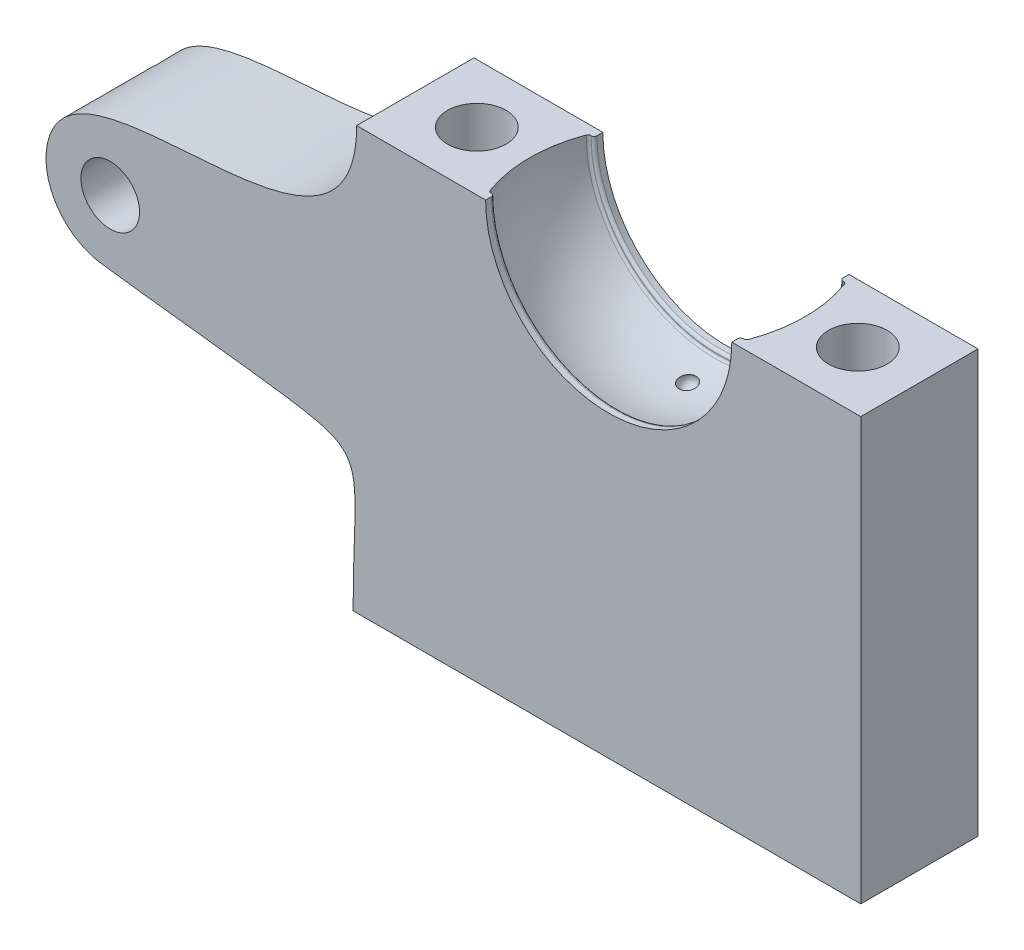
ISO-10303-21;
HEADER;
FILE_DESCRIPTION(('STEP AP214'),'2;1');
FILE_NAME('part.step','',(''),(''),'','','');
FILE_SCHEMA(('AUTOMOTIVE_DESIGN { 1 0 10303 214 1 1 1 1 }'));
ENDSEC;
DATA;
#1=APPLICATION_CONTEXT('core data for automotive mechanical design processes');
#2=APPLICATION_PROTOCOL_DEFINITION('international standard','automotive_design',2000,#1);
#3=PRODUCT_CONTEXT('',#1,'mechanical');
#4=PRODUCT('Part','Part','',(#3));
#5=PRODUCT_RELATED_PRODUCT_CATEGORY('part','',(#4));
#6=PRODUCT_DEFINITION_FORMATION('','',#4);
#7=PRODUCT_DEFINITION_CONTEXT('part definition',#1,'design');
#8=PRODUCT_DEFINITION('design','',#6,#7);
#9=PRODUCT_DEFINITION_SHAPE('','',#8);
#10=(LENGTH_UNIT() NAMED_UNIT(*) SI_UNIT(.MILLI.,.METRE.));
#11=(NAMED_UNIT(*) PLANE_ANGLE_UNIT() SI_UNIT($,.RADIAN.));
#12=(NAMED_UNIT(*) SI_UNIT($,.STERADIAN.) SOLID_ANGLE_UNIT());
#13=UNCERTAINTY_MEASURE_WITH_UNIT(LENGTH_MEASURE(1.E-05),#10,'distance_accuracy_value','');
#14=(GEOMETRIC_REPRESENTATION_CONTEXT(3) GLOBAL_UNCERTAINTY_ASSIGNED_CONTEXT((#13)) GLOBAL_UNIT_ASSIGNED_CONTEXT((#10,
#11,#12)) REPRESENTATION_CONTEXT('',''));
#15=CARTESIAN_POINT('',(0.,0.,0.));
#16=DIRECTION('',(0.,0.,1.));
#17=DIRECTION('',(1.,0.,0.));
#18=AXIS2_PLACEMENT_3D('',#15,#16,#17);
#19=CARTESIAN_POINT('',(-43.,72.,20.));
#20=DIRECTION('',(0.,-1.,0.));
#21=DIRECTION('',(0.,0.,-1.));
#22=AXIS2_PLACEMENT_3D('',#19,#20,#21);
#23=PLANE('',#22);
#24=CARTESIAN_POINT('',(-32.5,72.,10.));
#25=DIRECTION('',(0.,1.,0.));
#26=DIRECTION('',(0.,0.,1.));
#27=AXIS2_PLACEMENT_3D('',#24,#25,#26);
#28=CIRCLE('',#27,5.);
#29=CARTESIAN_POINT('',(-32.5,72.,15.));
#30=VERTEX_POINT('',#29);
#31=EDGE_CURVE('E173',#30,#30,#28,.T.);
#32=ORIENTED_EDGE('',*,*,#31,.F.);
#33=EDGE_LOOP('',(#32));
#34=FACE_BOUND('',#33,.T.);
#35=DIRECTION('',(-1.,0.,0.));
#36=VECTOR('',#35,1.);
#37=CARTESIAN_POINT('',(-43.,72.,0.));
#38=LINE('',#37,#36);
#39=CARTESIAN_POINT('',(-21.,72.,0.));
#40=VERTEX_POINT('',#39);
#41=CARTESIAN_POINT('',(-43.,72.,0.));
#42=VERTEX_POINT('',#41);
#43=EDGE_CURVE('E164',#40,#42,#38,.T.);
#44=ORIENTED_EDGE('',*,*,#43,.T.);
#45=DIRECTION('',(0.,0.,1.));
#46=VECTOR('',#45,1.);
#47=CARTESIAN_POINT('',(-43.,72.,0.));
#48=LINE('',#47,#46);
#49=CARTESIAN_POINT('',(-43.,72.,20.));
#50=VERTEX_POINT('',#49);
#51=EDGE_CURVE('E147',#42,#50,#48,.T.);
#52=ORIENTED_EDGE('',*,*,#51,.T.);
#53=DIRECTION('',(-1.,0.,0.));
#54=VECTOR('',#53,1.);
#55=CARTESIAN_POINT('',(-43.,72.,20.));
#56=LINE('',#55,#54);
#57=CARTESIAN_POINT('',(-21.,72.,20.));
#58=VERTEX_POINT('',#57);
#59=EDGE_CURVE('E187',#58,#50,#56,.T.);
#60=ORIENTED_EDGE('',*,*,#59,.F.);
#61=DIRECTION('',(0.,0.,-1.));
#62=VECTOR('',#61,1.);
#63=CARTESIAN_POINT('',(-21.,72.,0.));
#64=LINE('',#63,#62);
#65=CARTESIAN_POINT('',(-21.,72.,19.));
#66=VERTEX_POINT('',#65);
#67=EDGE_CURVE('E276',#58,#66,#64,.T.);
#68=ORIENTED_EDGE('',*,*,#67,.T.);
#69=CARTESIAN_POINT('',(-21.5,72.,19.));
#70=DIRECTION('',(0.,-1.,0.));
#71=DIRECTION('',(0.,0.,-1.));
#72=AXIS2_PLACEMENT_3D('',#69,#70,#71);
#73=CIRCLE('',#72,0.5);
#74=CARTESIAN_POINT('',(-21.5,72.,18.5));
#75=VERTEX_POINT('',#74);
#76=EDGE_CURVE('E239',#66,#75,#73,.F.);
#77=ORIENTED_EDGE('',*,*,#76,.T.);
#78=DIRECTION('',(-1.,0.,0.));
#79=VECTOR('',#78,1.);
#80=CARTESIAN_POINT('',(-43.,72.,18.5));
#81=LINE('',#80,#79);
#82=CARTESIAN_POINT('',(-21.5638586528478,72.,18.5));
#83=VERTEX_POINT('',#82);
#84=EDGE_CURVE('E209',#75,#83,#81,.T.);
#85=ORIENTED_EDGE('',*,*,#84,.T.);
#86=CARTESIAN_POINT('',(-21.5638586528478,72.,18.));
#87=DIRECTION('',(0.,-1.,0.));
#88=DIRECTION('',(0.,0.,-1.));
#89=AXIS2_PLACEMENT_3D('',#86,#87,#88);
#90=CIRCLE('',#89,0.5);
#91=CARTESIAN_POINT('',(-22.0326381887793,72.,18.1739130434783));
#92=VERTEX_POINT('',#91);
#93=EDGE_CURVE('E230',#83,#92,#90,.T.);
#94=ORIENTED_EDGE('',*,*,#93,.T.);
#95=CARTESIAN_POINT('',(0.,72.,10.));
#96=DIRECTION('',(0.,-1.,0.));
#97=DIRECTION('',(0.,0.,-1.));
#98=AXIS2_PLACEMENT_3D('',#95,#96,#97);
#99=CIRCLE('',#98,23.5);
#100=CARTESIAN_POINT('',(-22.0326381887793,72.,1.82608695652174));
#101=VERTEX_POINT('',#100);
#102=EDGE_CURVE('E206',#92,#101,#99,.T.);
#103=ORIENTED_EDGE('',*,*,#102,.T.);
#104=CARTESIAN_POINT('',(-21.5638586528478,72.,2.));
#105=DIRECTION('',(0.,-1.,0.));
#106=DIRECTION('',(0.,0.,-1.));
#107=AXIS2_PLACEMENT_3D('',#104,#105,#106);
#108=CIRCLE('',#107,0.5);
#109=CARTESIAN_POINT('',(-21.5638586528478,72.,1.5));
#110=VERTEX_POINT('',#109);
#111=EDGE_CURVE('E226',#101,#110,#108,.T.);
#112=ORIENTED_EDGE('',*,*,#111,.T.);
#113=DIRECTION('',(1.,0.,0.));
#114=VECTOR('',#113,1.);
#115=CARTESIAN_POINT('',(-43.,72.,1.50000000000002));
#116=LINE('',#115,#114);
#117=CARTESIAN_POINT('',(-21.5,72.,1.5));
#118=VERTEX_POINT('',#117);
#119=EDGE_CURVE('E202',#110,#118,#116,.T.);
#120=ORIENTED_EDGE('',*,*,#119,.T.);
#121=CARTESIAN_POINT('',(-21.5,72.,1.));
#122=DIRECTION('',(0.,-1.,0.));
#123=DIRECTION('',(0.,0.,-1.));
#124=AXIS2_PLACEMENT_3D('',#121,#122,#123);
#125=CIRCLE('',#124,0.5);
#126=CARTESIAN_POINT('',(-21.,72.,1.));
#127=VERTEX_POINT('',#126);
#128=EDGE_CURVE('E237',#118,#127,#125,.F.);
#129=ORIENTED_EDGE('',*,*,#128,.T.);
#130=DIRECTION('',(0.,0.,-1.));
#131=VECTOR('',#130,1.);
#132=CARTESIAN_POINT('',(-21.,72.,0.));
#133=LINE('',#132,#131);
#134=EDGE_CURVE('E170',#127,#40,#133,.T.);
#135=ORIENTED_EDGE('',*,*,#134,.T.);
#136=EDGE_LOOP('',(#44,#52,#60,#68,#77,#85,#94,#103,#112,#120,#129,#135));
#137=FACE_BOUND('',#136,.T.);
#138=ADVANCED_FACE('F33',(#34,#137),#23,.F.);
#139=CARTESIAN_POINT('',(32.5,72.,9.99999999999999));
#140=DIRECTION('',(0.,1.,0.));
#141=DIRECTION('',(0.,0.,-1.));
#142=AXIS2_PLACEMENT_3D('',#139,#140,#141);
#143=CIRCLE('',#142,5.);
#144=CARTESIAN_POINT('',(32.5,72.,4.99999999999999));
#145=VERTEX_POINT('',#144);
#146=EDGE_CURVE('E282',#145,#145,#143,.T.);
#147=ORIENTED_EDGE('',*,*,#146,.F.);
#148=EDGE_LOOP('',(#147));
#149=FACE_BOUND('',#148,.T.);
#150=CARTESIAN_POINT('',(21.5638586528478,72.,18.5));
#151=VERTEX_POINT('',#150);
#152=CARTESIAN_POINT('',(21.5,72.,18.5));
#153=VERTEX_POINT('',#152);
#154=EDGE_CURVE('E205',#151,#153,#81,.T.);
#155=ORIENTED_EDGE('',*,*,#154,.T.);
#156=CARTESIAN_POINT('',(21.5,72.,19.));
#157=DIRECTION('',(0.,-1.,0.));
#158=DIRECTION('',(0.,0.,-1.));
#159=AXIS2_PLACEMENT_3D('',#156,#157,#158);
#160=CIRCLE('',#159,0.5);
#161=CARTESIAN_POINT('',(21.,72.,19.));
#162=VERTEX_POINT('',#161);
#163=EDGE_CURVE('E244',#153,#162,#160,.F.);
#164=ORIENTED_EDGE('',*,*,#163,.T.);
#165=DIRECTION('',(0.,0.,-1.));
#166=VECTOR('',#165,1.);
#167=CARTESIAN_POINT('',(21.,72.,0.));
#168=LINE('',#167,#166);
#169=CARTESIAN_POINT('',(21.,72.,20.));
#170=VERTEX_POINT('',#169);
#171=EDGE_CURVE('E278',#162,#170,#168,.F.);
#172=ORIENTED_EDGE('',*,*,#171,.T.);
#173=CARTESIAN_POINT('',(43.,72.,20.));
#174=VERTEX_POINT('',#173);
#175=EDGE_CURVE('E291',#174,#170,#56,.T.);
#176=ORIENTED_EDGE('',*,*,#175,.F.);
#177=DIRECTION('',(0.,0.,-1.));
#178=VECTOR('',#177,1.);
#179=CARTESIAN_POINT('',(43.,72.,20.));
#180=LINE('',#179,#178);
#181=CARTESIAN_POINT('',(43.,72.,0.));
#182=VERTEX_POINT('',#181);
#183=EDGE_CURVE('E188',#174,#182,#180,.T.);
#184=ORIENTED_EDGE('',*,*,#183,.T.);
#185=CARTESIAN_POINT('',(21.,72.,0.));
#186=VERTEX_POINT('',#185);
#187=EDGE_CURVE('E172',#182,#186,#38,.T.);
#188=ORIENTED_EDGE('',*,*,#187,.T.);
#189=DIRECTION('',(0.,0.,-1.));
#190=VECTOR('',#189,1.);
#191=CARTESIAN_POINT('',(21.,72.,0.));
#192=LINE('',#191,#190);
#193=CARTESIAN_POINT('',(21.,72.,0.999999999999964));
#194=VERTEX_POINT('',#193);
#195=EDGE_CURVE('E213',#186,#194,#192,.F.);
#196=ORIENTED_EDGE('',*,*,#195,.T.);
#197=CARTESIAN_POINT('',(21.5,72.,0.999999999999964));
#198=DIRECTION('',(0.,-1.,0.));
#199=DIRECTION('',(0.,0.,-1.));
#200=AXIS2_PLACEMENT_3D('',#197,#198,#199);
#201=CIRCLE('',#200,0.5);
#202=CARTESIAN_POINT('',(21.5,72.,1.49999999999997));
#203=VERTEX_POINT('',#202);
#204=EDGE_CURVE('E57',#194,#203,#201,.F.);
#205=ORIENTED_EDGE('',*,*,#204,.T.);
#206=CARTESIAN_POINT('',(21.5638586528478,72.,1.49999999999997));
#207=VERTEX_POINT('',#206);
#208=EDGE_CURVE('E199',#203,#207,#116,.T.);
#209=ORIENTED_EDGE('',*,*,#208,.T.);
#210=CARTESIAN_POINT('',(21.5638586528478,72.,1.99999999999996));
#211=DIRECTION('',(0.,-1.,0.));
#212=DIRECTION('',(0.,0.,-1.));
#213=AXIS2_PLACEMENT_3D('',#210,#211,#212);
#214=CIRCLE('',#213,0.5);
#215=CARTESIAN_POINT('',(22.0326381887793,72.,1.8260869565217));
#216=VERTEX_POINT('',#215);
#217=EDGE_CURVE('E228',#207,#216,#214,.T.);
#218=ORIENTED_EDGE('',*,*,#217,.T.);
#219=CARTESIAN_POINT('',(22.0326381887793,72.,18.1739130434782));
#220=VERTEX_POINT('',#219);
#221=EDGE_CURVE('E201',#216,#220,#99,.T.);
#222=ORIENTED_EDGE('',*,*,#221,.T.);
#223=CARTESIAN_POINT('',(21.5638586528478,72.,18.));
#224=DIRECTION('',(0.,-1.,0.));
#225=DIRECTION('',(0.,0.,-1.));
#226=AXIS2_PLACEMENT_3D('',#223,#224,#225);
#227=CIRCLE('',#226,0.5);
#228=EDGE_CURVE('E232',#220,#151,#227,.T.);
#229=ORIENTED_EDGE('',*,*,#228,.T.);
#230=EDGE_LOOP('',(#155,#164,#172,#176,#184,#188,#196,#205,#209,#218,#222,#229));
#231=FACE_BOUND('',#230,.T.);
#232=ADVANCED_FACE('F269',(#149,#231),#23,.F.);
#233=CARTESIAN_POINT('',(43.,0.,20.));
#234=DIRECTION('',(0.,1.,0.));
#235=DIRECTION('',(0.,0.,1.));
#236=AXIS2_PLACEMENT_3D('',#233,#234,#235);
#237=PLANE('',#236);
#238=CARTESIAN_POINT('',(-32.5,0.,10.));
#239=DIRECTION('',(0.,1.,0.));
#240=DIRECTION('',(0.,0.,1.));
#241=AXIS2_PLACEMENT_3D('',#238,#239,#240);
#242=CIRCLE('',#241,5.);
#243=CARTESIAN_POINT('',(-32.5,0.,15.));
#244=VERTEX_POINT('',#243);
#245=EDGE_CURVE('E178',#244,#244,#242,.T.);
#246=ORIENTED_EDGE('',*,*,#245,.T.);
#247=EDGE_LOOP('',(#246));
#248=FACE_BOUND('',#247,.T.);
#249=CARTESIAN_POINT('',(32.5,0.,9.99999999999999));
#250=DIRECTION('',(0.,1.,0.));
#251=DIRECTION('',(0.,0.,-1.));
#252=AXIS2_PLACEMENT_3D('',#249,#250,#251);
#253=CIRCLE('',#252,5.);
#254=CARTESIAN_POINT('',(32.5,0.,4.99999999999999));
#255=VERTEX_POINT('',#254);
#256=EDGE_CURVE('E279',#255,#255,#253,.T.);
#257=ORIENTED_EDGE('',*,*,#256,.T.);
#258=EDGE_LOOP('',(#257));
#259=FACE_BOUND('',#258,.T.);
#260=DIRECTION('',(1.,0.,0.));
#261=VECTOR('',#260,1.);
#262=CARTESIAN_POINT('',(43.,0.,20.));
#263=LINE('',#262,#261);
#264=CARTESIAN_POINT('',(-43.6110814875633,0.,20.));
#265=VERTEX_POINT('',#264);
#266=CARTESIAN_POINT('',(43.,0.,20.));
#267=VERTEX_POINT('',#266);
#268=EDGE_CURVE('E293',#265,#267,#263,.T.);
#269=ORIENTED_EDGE('',*,*,#268,.F.);
#270=DIRECTION('',(0.,0.,1.));
#271=VECTOR('',#270,1.);
#272=CARTESIAN_POINT('',(-43.6110814875633,0.,0.));
#273=LINE('',#272,#271);
#274=CARTESIAN_POINT('',(-43.6110814875633,0.,0.));
#275=VERTEX_POINT('',#274);
#276=EDGE_CURVE('E158',#275,#265,#273,.T.);
#277=ORIENTED_EDGE('',*,*,#276,.F.);
#278=DIRECTION('',(1.,0.,0.));
#279=VECTOR('',#278,1.);
#280=CARTESIAN_POINT('',(43.,0.,0.));
#281=LINE('',#280,#279);
#282=CARTESIAN_POINT('',(43.,0.,0.));
#283=VERTEX_POINT('',#282);
#284=EDGE_CURVE('E176',#275,#283,#281,.T.);
#285=ORIENTED_EDGE('',*,*,#284,.T.);
#286=DIRECTION('',(0.,0.,-1.));
#287=VECTOR('',#286,1.);
#288=CARTESIAN_POINT('',(43.,0.,20.));
#289=LINE('',#288,#287);
#290=EDGE_CURVE('E191',#267,#283,#289,.T.);
#291=ORIENTED_EDGE('',*,*,#290,.F.);
#292=EDGE_LOOP('',(#269,#277,#285,#291));
#293=FACE_BOUND('',#292,.T.);
#294=ADVANCED_FACE('F339',(#248,#259,#293),#237,.F.);
#295=CARTESIAN_POINT('',(43.,0.,20.));
#296=DIRECTION('',(-1.,0.,0.));
#297=DIRECTION('',(0.,0.,1.));
#298=AXIS2_PLACEMENT_3D('',#295,#296,#297);
#299=PLANE('',#298);
#300=DIRECTION('',(0.,1.,0.));
#301=VECTOR('',#300,1.);
#302=CARTESIAN_POINT('',(43.,0.,0.));
#303=LINE('',#302,#301);
#304=EDGE_CURVE('E185',#283,#182,#303,.T.);
#305=ORIENTED_EDGE('',*,*,#304,.T.);
#306=ORIENTED_EDGE('',*,*,#183,.F.);
#307=DIRECTION('',(0.,1.,0.));
#308=VECTOR('',#307,1.);
#309=CARTESIAN_POINT('',(43.,0.,20.));
#310=LINE('',#309,#308);
#311=EDGE_CURVE('E182',#267,#174,#310,.T.);
#312=ORIENTED_EDGE('',*,*,#311,.F.);
#313=ORIENTED_EDGE('',*,*,#290,.T.);
#314=EDGE_LOOP('',(#305,#306,#312,#313));
#315=FACE_BOUND('',#314,.T.);
#316=ADVANCED_FACE('F304',(#315),#299,.F.);
#317=CARTESIAN_POINT('',(0.,0.,20.));
#318=DIRECTION('',(0.,0.,1.));
#319=DIRECTION('',(1.,0.,0.));
#320=AXIS2_PLACEMENT_3D('',#317,#318,#319);
#321=PLANE('',#320);
#322=CARTESIAN_POINT('',(-95.7369426501678,43.0746236616197,20.));
#323=CARTESIAN_POINT('',(-91.2809728800379,63.0480531499115,20.));
#324=CARTESIAN_POINT('',(-43.,42.3373275564718,20.));
#325=CARTESIAN_POINT('',(-43.,72.,20.));
#326=B_SPLINE_CURVE_WITH_KNOTS('',3,(#322,#323,#324,#325),.UNSPECIFIED.,.F.,.F.,(4,4),(0.,1.),.UNSPECIFIED.);
#327=CARTESIAN_POINT('',(-95.7369426501678,43.0746236616197,20.));
#328=VERTEX_POINT('',#327);
#329=EDGE_CURVE('E153',#328,#50,#326,.T.);
#330=ORIENTED_EDGE('',*,*,#329,.F.);
#331=CARTESIAN_POINT('',(-85.0363719515138,40.6873811710754,20.));
#332=DIRECTION('',(0.,0.,-1.));
#333=DIRECTION('',(1.,0.,0.));
#334=AXIS2_PLACEMENT_3D('',#331,#332,#333);
#335=CIRCLE('',#334,10.9636280484862);
#336=CARTESIAN_POINT('',(-86.4959846577841,29.8213482826084,20.));
#337=VERTEX_POINT('',#336);
#338=EDGE_CURVE('E167',#337,#328,#335,.T.);
#339=ORIENTED_EDGE('',*,*,#338,.F.);
#340=CARTESIAN_POINT('',(-43.6110814875633,0.,20.));
#341=CARTESIAN_POINT('',(-43.6110814875633,22.1721424201184,20.));
#342=CARTESIAN_POINT('',(-38.3816533680022,24.5790084994484,20.));
#343=CARTESIAN_POINT('',(-76.0068381159622,28.4123619738494,20.));
#344=CARTESIAN_POINT('',(-86.4959846577841,29.8213482826084,20.));
#345=B_SPLINE_CURVE_WITH_KNOTS('',3,(#340,#341,#342,#343,#344),.UNSPECIFIED.,.F.,.F.,(4,1,4),
(0.,0.653290552453199,1.),.UNSPECIFIED.);
#346=EDGE_CURVE('E308',#265,#337,#345,.T.);
#347=ORIENTED_EDGE('',*,*,#346,.F.);
#348=ORIENTED_EDGE('',*,*,#268,.T.);
#349=ORIENTED_EDGE('',*,*,#311,.T.);
#350=ORIENTED_EDGE('',*,*,#175,.T.);
#351=CARTESIAN_POINT('',(0.,72.,20.));
#352=DIRECTION('',(0.,0.,1.));
#353=DIRECTION('',(1.,0.,0.));
#354=AXIS2_PLACEMENT_3D('',#351,#352,#353);
#355=CIRCLE('',#354,21.);
#356=EDGE_CURVE('E196',#58,#170,#355,.T.);
#357=ORIENTED_EDGE('',*,*,#356,.F.);
#358=ORIENTED_EDGE('',*,*,#59,.T.);
#359=EDGE_LOOP('',(#330,#339,#347,#348,#349,#350,#357,#358));
#360=FACE_BOUND('',#359,.T.);
#361=CARTESIAN_POINT('',(-85.0363719515138,40.6873811710754,20.));
#362=DIRECTION('',(0.,0.,1.));
#363=DIRECTION('',(1.,0.,0.));
#364=AXIS2_PLACEMENT_3D('',#361,#362,#363);
#365=CIRCLE('',#364,5.);
#366=CARTESIAN_POINT('',(-85.6060266642148,35.7199378137439,20.));
#367=VERTEX_POINT('',#366);
#368=EDGE_CURVE('E214',#367,#367,#365,.F.);
#369=ORIENTED_EDGE('',*,*,#368,.T.);
#370=EDGE_LOOP('',(#369));
#371=FACE_BOUND('',#370,.T.);
#372=ADVANCED_FACE('F300',(#360,#371),#321,.T.);
#373=CARTESIAN_POINT('',(0.,0.,0.));
#374=DIRECTION('',(0.,0.,1.));
#375=DIRECTION('',(1.,0.,0.));
#376=AXIS2_PLACEMENT_3D('',#373,#374,#375);
#377=PLANE('',#376);
#378=CARTESIAN_POINT('',(-85.0363719515138,40.6873811710754,0.));
#379=DIRECTION('',(0.,0.,1.));
#380=DIRECTION('',(1.,0.,0.));
#381=AXIS2_PLACEMENT_3D('',#378,#379,#380);
#382=CIRCLE('',#381,5.);
#383=CARTESIAN_POINT('',(-85.6060266642148,35.7199378137439,0.));
#384=VERTEX_POINT('',#383);
#385=EDGE_CURVE('E37',#384,#384,#382,.F.);
#386=ORIENTED_EDGE('',*,*,#385,.F.);
#387=EDGE_LOOP('',(#386));
#388=FACE_BOUND('',#387,.T.);
#389=CARTESIAN_POINT('',(-85.0363719515138,40.6873811710754,0.));
#390=DIRECTION('',(0.,0.,-1.));
#391=DIRECTION('',(1.,0.,0.));
#392=AXIS2_PLACEMENT_3D('',#389,#390,#391);
#393=CIRCLE('',#392,10.9636280484862);
#394=CARTESIAN_POINT('',(-86.4959846577841,29.8213482826084,0.));
#395=VERTEX_POINT('',#394);
#396=CARTESIAN_POINT('',(-95.7369426501678,43.0746236616197,0.));
#397=VERTEX_POINT('',#396);
#398=EDGE_CURVE('E49',#395,#397,#393,.T.);
#399=ORIENTED_EDGE('',*,*,#398,.T.);
#400=CARTESIAN_POINT('',(-95.7369426501678,43.0746236616197,0.));
#401=CARTESIAN_POINT('',(-91.2809728800379,63.0480531499115,0.));
#402=CARTESIAN_POINT('',(-43.,42.3373275564718,0.));
#403=CARTESIAN_POINT('',(-43.,72.,0.));
#404=B_SPLINE_CURVE_WITH_KNOTS('',3,(#400,#401,#402,#403),.UNSPECIFIED.,.F.,.F.,(4,4),(0.,1.),.UNSPECIFIED.);
#405=EDGE_CURVE('E151',#397,#42,#404,.T.);
#406=ORIENTED_EDGE('',*,*,#405,.T.);
#407=ORIENTED_EDGE('',*,*,#43,.F.);
#408=CARTESIAN_POINT('',(0.,72.,0.));
#409=DIRECTION('',(0.,0.,1.));
#410=DIRECTION('',(1.,0.,0.));
#411=AXIS2_PLACEMENT_3D('',#408,#409,#410);
#412=CIRCLE('',#411,21.);
#413=EDGE_CURVE('E194',#40,#186,#412,.T.);
#414=ORIENTED_EDGE('',*,*,#413,.T.);
#415=ORIENTED_EDGE('',*,*,#187,.F.);
#416=ORIENTED_EDGE('',*,*,#304,.F.);
#417=ORIENTED_EDGE('',*,*,#284,.F.);
#418=CARTESIAN_POINT('',(-43.6110814875633,0.,0.));
#419=CARTESIAN_POINT('',(-43.6110814875633,22.1721424201184,0.));
#420=CARTESIAN_POINT('',(-38.3816533680022,24.5790084994484,0.));
#421=CARTESIAN_POINT('',(-76.0068381159622,28.4123619738494,0.));
#422=CARTESIAN_POINT('',(-86.4959846577841,29.8213482826084,0.));
#423=B_SPLINE_CURVE_WITH_KNOTS('',3,(#418,#419,#420,#421,#422),.UNSPECIFIED.,.F.,.F.,(4,1,4),
(0.,0.653290552453199,1.),.UNSPECIFIED.);
#424=EDGE_CURVE('E166',#275,#395,#423,.T.);
#425=ORIENTED_EDGE('',*,*,#424,.T.);
#426=EDGE_LOOP('',(#399,#406,#407,#414,#415,#416,#417,#425));
#427=FACE_BOUND('',#426,.T.);
#428=ADVANCED_FACE('F162',(#388,#427),#377,.F.);
#429=CARTESIAN_POINT('',(32.5,72.,9.99999999999999));
#430=DIRECTION('',(0.,-1.,0.));
#431=DIRECTION('',(0.,0.,-1.));
#432=AXIS2_PLACEMENT_3D('',#429,#430,#431);
#433=CYLINDRICAL_SURFACE('',#432,5.);
#434=ORIENTED_EDGE('',*,*,#146,.T.);
#435=EDGE_LOOP('',(#434));
#436=FACE_BOUND('',#435,.T.);
#437=ORIENTED_EDGE('',*,*,#256,.F.);
#438=EDGE_LOOP('',(#437));
#439=FACE_BOUND('',#438,.T.);
#440=ADVANCED_FACE('F382',(#436,#439),#433,.F.);
#441=CARTESIAN_POINT('',(-32.5,72.,10.));
#442=DIRECTION('',(0.,-1.,0.));
#443=DIRECTION('',(0.,0.,-1.));
#444=AXIS2_PLACEMENT_3D('',#441,#442,#443);
#445=CYLINDRICAL_SURFACE('',#444,5.);
#446=ORIENTED_EDGE('',*,*,#31,.T.);
#447=EDGE_LOOP('',(#446));
#448=FACE_BOUND('',#447,.T.);
#449=ORIENTED_EDGE('',*,*,#245,.F.);
#450=EDGE_LOOP('',(#449));
#451=FACE_BOUND('',#450,.T.);
#452=ADVANCED_FACE('F377',(#448,#451),#445,.F.);
#453=CARTESIAN_POINT('',(-21.,72.,18.5));
#454=DIRECTION('',(0.,0.,1.));
#455=DIRECTION('',(1.,0.,0.));
#456=AXIS2_PLACEMENT_3D('',#453,#454,#455);
#457=PLANE('',#456);
#458=ORIENTED_EDGE('',*,*,#84,.F.);
#459=CARTESIAN_POINT('',(0.,72.,18.5));
#460=DIRECTION('',(0.,0.,1.));
#461=DIRECTION('',(1.,0.,0.));
#462=AXIS2_PLACEMENT_3D('',#459,#460,#461);
#463=CIRCLE('',#462,21.5);
#464=EDGE_CURVE('E241',#75,#153,#463,.T.);
#465=ORIENTED_EDGE('',*,*,#464,.T.);
#466=ORIENTED_EDGE('',*,*,#154,.F.);
#467=CARTESIAN_POINT('',(0.,72.,18.5));
#468=DIRECTION('',(0.,0.,1.));
#469=DIRECTION('',(1.,0.,0.));
#470=AXIS2_PLACEMENT_3D('',#467,#468,#469);
#471=CIRCLE('',#470,21.5638586528478);
#472=EDGE_CURVE('E223',#151,#83,#471,.F.);
#473=ORIENTED_EDGE('',*,*,#472,.T.);
#474=EDGE_LOOP('',(#458,#465,#466,#473));
#475=FACE_BOUND('',#474,.T.);
#476=ADVANCED_FACE('F267',(#475),#457,.F.);
#477=CARTESIAN_POINT('',(0.,72.,10.));
#478=DIRECTION('',(0.,0.,-1.));
#479=DIRECTION('',(-1.,0.,0.));
#480=AXIS2_PLACEMENT_3D('',#477,#478,#479);
#481=SPHERICAL_SURFACE('',#480,23.5);
#482=CARTESIAN_POINT('',(0.,48.8018157661647,6.54495128432241));
#483=DIRECTION('',(0.,-0.989090177881817,-0.147311303088781));
#484=DIRECTION('',(0.,0.147311303088781,-0.989090177881817));
#485=AXIS2_PLACEMENT_3D('',#482,#483,#484);
#486=CIRCLE('',#485,1.4686342721495);
#487=CARTESIAN_POINT('',(0.,49.0181621945559,5.09233955083873));
#488=VERTEX_POINT('',#487);
#489=EDGE_CURVE('E210',#488,#488,#486,.T.);
#490=ORIENTED_EDGE('',*,*,#489,.T.);
#491=EDGE_LOOP('',(#490));
#492=FACE_BOUND('',#491,.T.);
#493=ORIENTED_EDGE('',*,*,#221,.F.);
#494=CARTESIAN_POINT('',(0.,72.,1.82608695652172));
#495=DIRECTION('',(0.,0.,1.));
#496=DIRECTION('',(1.,0.,0.));
#497=AXIS2_PLACEMENT_3D('',#494,#495,#496);
#498=CIRCLE('',#497,22.0326381887793);
#499=EDGE_CURVE('E217',#216,#101,#498,.F.);
#500=ORIENTED_EDGE('',*,*,#499,.T.);
#501=ORIENTED_EDGE('',*,*,#102,.F.);
#502=CARTESIAN_POINT('',(0.,72.,18.1739130434782));
#503=DIRECTION('',(0.,0.,-1.));
#504=DIRECTION('',(-1.,0.,0.));
#505=AXIS2_PLACEMENT_3D('',#502,#503,#504);
#506=CIRCLE('',#505,22.0326381887793);
#507=EDGE_CURVE('E215',#92,#220,#506,.F.);
#508=ORIENTED_EDGE('',*,*,#507,.T.);
#509=EDGE_LOOP('',(#493,#500,#501,#508));
#510=FACE_BOUND('',#509,.T.);
#511=ADVANCED_FACE('F371',(#492,#510),#481,.F.);
#512=CARTESIAN_POINT('',(-21.,72.,1.5));
#513=DIRECTION('',(0.,0.,-1.));
#514=DIRECTION('',(-1.,0.,0.));
#515=AXIS2_PLACEMENT_3D('',#512,#513,#514);
#516=PLANE('',#515);
#517=ORIENTED_EDGE('',*,*,#208,.F.);
#518=CARTESIAN_POINT('',(0.,72.,1.49999999999998));
#519=DIRECTION('',(0.,0.,-1.));
#520=DIRECTION('',(-1.,0.,0.));
#521=AXIS2_PLACEMENT_3D('',#518,#519,#520);
#522=CIRCLE('',#521,21.5);
#523=EDGE_CURVE('E42',#203,#118,#522,.T.);
#524=ORIENTED_EDGE('',*,*,#523,.T.);
#525=ORIENTED_EDGE('',*,*,#119,.F.);
#526=CARTESIAN_POINT('',(0.,72.,1.49999999999998));
#527=DIRECTION('',(0.,0.,-1.));
#528=DIRECTION('',(-1.,0.,0.));
#529=AXIS2_PLACEMENT_3D('',#526,#527,#528);
#530=CIRCLE('',#529,21.5638586528478);
#531=EDGE_CURVE('E220',#110,#207,#530,.F.);
#532=ORIENTED_EDGE('',*,*,#531,.T.);
#533=EDGE_LOOP('',(#517,#524,#525,#532));
#534=FACE_BOUND('',#533,.T.);
#535=ADVANCED_FACE('F251',(#534),#516,.F.);
#536=CARTESIAN_POINT('',(0.,72.,0.));
#537=DIRECTION('',(0.,0.,-1.));
#538=DIRECTION('',(-1.,0.,0.));
#539=AXIS2_PLACEMENT_3D('',#536,#537,#538);
#540=CYLINDRICAL_SURFACE('',#539,21.);
#541=ORIENTED_EDGE('',*,*,#171,.F.);
#542=CARTESIAN_POINT('',(0.,72.,19.));
#543=DIRECTION('',(0.,0.,1.));
#544=DIRECTION('',(1.,0.,0.));
#545=AXIS2_PLACEMENT_3D('',#542,#543,#544);
#546=CIRCLE('',#545,21.);
#547=EDGE_CURVE('E234',#162,#66,#546,.F.);
#548=ORIENTED_EDGE('',*,*,#547,.T.);
#549=ORIENTED_EDGE('',*,*,#67,.F.);
#550=ORIENTED_EDGE('',*,*,#356,.T.);
#551=EDGE_LOOP('',(#541,#548,#549,#550));
#552=FACE_BOUND('',#551,.T.);
#553=ADVANCED_FACE('F275',(#552),#540,.F.);
#554=CARTESIAN_POINT('',(0.,72.,0.));
#555=DIRECTION('',(0.,0.,-1.));
#556=DIRECTION('',(-1.,0.,0.));
#557=AXIS2_PLACEMENT_3D('',#554,#555,#556);
#558=CYLINDRICAL_SURFACE('',#557,21.);
#559=ORIENTED_EDGE('',*,*,#134,.F.);
#560=CARTESIAN_POINT('',(0.,72.,0.999999999999983));
#561=DIRECTION('',(0.,0.,-1.));
#562=DIRECTION('',(-1.,0.,0.));
#563=AXIS2_PLACEMENT_3D('',#560,#561,#562);
#564=CIRCLE('',#563,21.);
#565=EDGE_CURVE('E11',#127,#194,#564,.F.);
#566=ORIENTED_EDGE('',*,*,#565,.T.);
#567=ORIENTED_EDGE('',*,*,#195,.F.);
#568=ORIENTED_EDGE('',*,*,#413,.F.);
#569=EDGE_LOOP('',(#559,#566,#567,#568));
#570=FACE_BOUND('',#569,.T.);
#571=ADVANCED_FACE('F335',(#570),#558,.F.);
#572=CARTESIAN_POINT('',(0.,48.5,6.5));
#573=DIRECTION('',(0.,0.,-1.));
#574=DIRECTION('',(1.,0.,0.));
#575=AXIS2_PLACEMENT_3D('',#572,#573,#574);
#576=SPHERICAL_SURFACE('',#575,1.5);
#577=CARTESIAN_POINT('',(0.,48.5,6.5));
#578=DIRECTION('',(0.,-0.989090177881817,-0.147311303088781));
#579=DIRECTION('',(0.,0.147311303088781,-0.989090177881817));
#580=AXIS2_PLACEMENT_3D('',#577,#578,#579);
#581=SPHERICAL_SURFACE('',#580,1.5);
#582=ORIENTED_EDGE('',*,*,#489,.F.);
#583=EDGE_LOOP('',(#582));
#584=FACE_BOUND('',#583,.T.);
#585=ADVANCED_FACE('F362',(#584),#581,.F.);
#586=CARTESIAN_POINT('',(0.,72.,1.99999999999998));
#587=DIRECTION('',(0.,0.,-1.));
#588=DIRECTION('',(-1.,0.,0.));
#589=AXIS2_PLACEMENT_3D('',#586,#587,#588);
#590=TOROIDAL_SURFACE('',#589,21.5638586528478,0.5);
#591=ORIENTED_EDGE('',*,*,#217,.F.);
#592=ORIENTED_EDGE('',*,*,#531,.F.);
#593=ORIENTED_EDGE('',*,*,#111,.F.);
#594=ORIENTED_EDGE('',*,*,#499,.F.);
#595=EDGE_LOOP('',(#591,#592,#593,#594));
#596=FACE_BOUND('',#595,.T.);
#597=ADVANCED_FACE('F365',(#596),#590,.F.);
#598=CARTESIAN_POINT('',(0.,72.,18.));
#599=DIRECTION('',(0.,0.,1.));
#600=DIRECTION('',(1.,0.,0.));
#601=AXIS2_PLACEMENT_3D('',#598,#599,#600);
#602=TOROIDAL_SURFACE('',#601,21.5638586528478,0.5);
#603=ORIENTED_EDGE('',*,*,#228,.F.);
#604=ORIENTED_EDGE('',*,*,#507,.F.);
#605=ORIENTED_EDGE('',*,*,#93,.F.);
#606=ORIENTED_EDGE('',*,*,#472,.F.);
#607=EDGE_LOOP('',(#603,#604,#605,#606));
#608=FACE_BOUND('',#607,.T.);
#609=ADVANCED_FACE('F265',(#608),#602,.F.);
#610=CARTESIAN_POINT('',(0.,72.,19.));
#611=DIRECTION('',(0.,0.,1.));
#612=DIRECTION('',(1.,0.,0.));
#613=AXIS2_PLACEMENT_3D('',#610,#611,#612);
#614=TOROIDAL_SURFACE('',#613,21.5,0.5);
#615=ORIENTED_EDGE('',*,*,#163,.F.);
#616=ORIENTED_EDGE('',*,*,#464,.F.);
#617=ORIENTED_EDGE('',*,*,#76,.F.);
#618=ORIENTED_EDGE('',*,*,#547,.F.);
#619=EDGE_LOOP('',(#615,#616,#617,#618));
#620=FACE_BOUND('',#619,.T.);
#621=ADVANCED_FACE('F273',(#620),#614,.T.);
#622=CARTESIAN_POINT('',(0.,72.,0.999999999999983));
#623=DIRECTION('',(0.,0.,-1.));
#624=DIRECTION('',(-1.,0.,0.));
#625=AXIS2_PLACEMENT_3D('',#622,#623,#624);
#626=TOROIDAL_SURFACE('',#625,21.5,0.5);
#627=ORIENTED_EDGE('',*,*,#204,.F.);
#628=ORIENTED_EDGE('',*,*,#565,.F.);
#629=ORIENTED_EDGE('',*,*,#128,.F.);
#630=ORIENTED_EDGE('',*,*,#523,.F.);
#631=EDGE_LOOP('',(#627,#628,#629,#630));
#632=FACE_BOUND('',#631,.T.);
#633=ADVANCED_FACE('F35',(#632),#626,.T.);
#634=CARTESIAN_POINT('',(-85.0363719515139,40.6873811710754,-164.197833849853));
#635=DIRECTION('',(0.,0.,1.));
#636=DIRECTION('',(-0.113930942540202,-0.993488671466314,0.));
#637=AXIS2_PLACEMENT_3D('',#634,#635,#636);
#638=CYLINDRICAL_SURFACE('',#637,5.);
#639=CARTESIAN_POINT('',(-85.6060266642148,35.7199378137439,20.));
#640=CARTESIAN_POINT('',(-85.6060266642148,35.7199378137439,19.7916666666667));
#641=CARTESIAN_POINT('',(-85.6060266642148,35.7199378137439,19.5833333333333));
#642=CARTESIAN_POINT('',(-85.6060266642148,35.7199378137439,19.1666666666667));
#643=CARTESIAN_POINT('',(-85.6060266642148,35.7199378137439,18.9583333333333));
#644=CARTESIAN_POINT('',(-85.6060266642148,35.7199378137439,18.5416666666667));
#645=CARTESIAN_POINT('',(-85.6060266642148,35.7199378137439,18.3333333333333));
#646=CARTESIAN_POINT('',(-85.6060266642148,35.7199378137439,17.9166666666666));
#647=CARTESIAN_POINT('',(-85.6060266642148,35.7199378137439,17.7083333333333));
#648=CARTESIAN_POINT('',(-85.6060266642148,35.7199378137439,17.2916666666667));
#649=CARTESIAN_POINT('',(-85.6060266642148,35.7199378137439,17.0833333333333));
#650=CARTESIAN_POINT('',(-85.6060266642148,35.7199378137439,16.6666666666667));
#651=CARTESIAN_POINT('',(-85.6060266642148,35.7199378137439,16.4583333333333));
#652=CARTESIAN_POINT('',(-85.6060266642148,35.7199378137439,16.0416666666667));
#653=CARTESIAN_POINT('',(-85.6060266642148,35.7199378137439,15.8333333333333));
#654=CARTESIAN_POINT('',(-85.6060266642148,35.7199378137439,15.4166666666666));
#655=CARTESIAN_POINT('',(-85.6060266642148,35.7199378137439,15.2083333333333));
#656=CARTESIAN_POINT('',(-85.6060266642148,35.7199378137439,14.7916666666667));
#657=CARTESIAN_POINT('',(-85.6060266642148,35.7199378137439,14.5833333333333));
#658=CARTESIAN_POINT('',(-85.6060266642148,35.7199378137439,14.1666666666667));
#659=CARTESIAN_POINT('',(-85.6060266642148,35.7199378137439,13.9583333333333));
#660=CARTESIAN_POINT('',(-85.6060266642148,35.7199378137439,13.5416666666666));
#661=CARTESIAN_POINT('',(-85.6060266642148,35.7199378137439,13.3333333333333));
#662=CARTESIAN_POINT('',(-85.6060266642148,35.7199378137439,12.9166666666666));
#663=CARTESIAN_POINT('',(-85.6060266642148,35.7199378137439,12.7083333333333));
#664=CARTESIAN_POINT('',(-85.6060266642148,35.7199378137439,12.2916666666667));
#665=CARTESIAN_POINT('',(-85.6060266642148,35.7199378137439,12.0833333333333));
#666=CARTESIAN_POINT('',(-85.6060266642148,35.7199378137439,11.6666666666667));
#667=CARTESIAN_POINT('',(-85.6060266642148,35.7199378137439,11.4583333333333));
#668=CARTESIAN_POINT('',(-85.6060266642148,35.7199378137439,11.0416666666666));
#669=CARTESIAN_POINT('',(-85.6060266642148,35.7199378137439,10.8333333333333));
#670=CARTESIAN_POINT('',(-85.6060266642148,35.7199378137439,10.4166666666666));
#671=CARTESIAN_POINT('',(-85.6060266642148,35.7199378137439,10.2083333333333));
#672=CARTESIAN_POINT('',(-85.6060266642148,35.7199378137439,9.79166666666665));
#673=CARTESIAN_POINT('',(-85.6060266642148,35.7199378137439,9.58333333333332));
#674=CARTESIAN_POINT('',(-85.6060266642148,35.7199378137439,9.16666666666666));
#675=CARTESIAN_POINT('',(-85.6060266642148,35.7199378137439,8.95833333333332));
#676=CARTESIAN_POINT('',(-85.6060266642148,35.7199378137439,8.54166666666664));
#677=CARTESIAN_POINT('',(-85.6060266642148,35.7199378137439,8.3333333333333));
#678=CARTESIAN_POINT('',(-85.6060266642148,35.7199378137439,7.91666666666664));
#679=CARTESIAN_POINT('',(-85.6060266642148,35.7199378137439,7.70833333333331));
#680=CARTESIAN_POINT('',(-85.6060266642148,35.7199378137439,7.29166666666665));
#681=CARTESIAN_POINT('',(-85.6060266642148,35.7199378137439,7.08333333333332));
#682=CARTESIAN_POINT('',(-85.6060266642148,35.7199378137439,6.66666666666665));
#683=CARTESIAN_POINT('',(-85.6060266642148,35.7199378137439,6.45833333333332));
#684=CARTESIAN_POINT('',(-85.6060266642148,35.7199378137439,6.04166666666664));
#685=CARTESIAN_POINT('',(-85.6060266642148,35.7199378137439,5.8333333333333));
#686=CARTESIAN_POINT('',(-85.6060266642148,35.7199378137439,5.41666666666663));
#687=CARTESIAN_POINT('',(-85.6060266642148,35.7199378137439,5.20833333333331));
#688=CARTESIAN_POINT('',(-85.6060266642148,35.7199378137439,4.79166666666665));
#689=CARTESIAN_POINT('',(-85.6060266642148,35.7199378137439,4.58333333333332));
#690=CARTESIAN_POINT('',(-85.6060266642148,35.7199378137439,4.16666666666665));
#691=CARTESIAN_POINT('',(-85.6060266642148,35.7199378137439,3.95833333333331));
#692=CARTESIAN_POINT('',(-85.6060266642148,35.7199378137439,3.54166666666664));
#693=CARTESIAN_POINT('',(-85.6060266642148,35.7199378137439,3.3333333333333));
#694=CARTESIAN_POINT('',(-85.6060266642148,35.7199378137439,2.91666666666663));
#695=CARTESIAN_POINT('',(-85.6060266642148,35.7199378137439,2.7083333333333));
#696=CARTESIAN_POINT('',(-85.6060266642148,35.7199378137439,2.29166666666665));
#697=CARTESIAN_POINT('',(-85.6060266642148,35.7199378137439,2.08333333333332));
#698=CARTESIAN_POINT('',(-85.6060266642148,35.7199378137439,1.66666666666665));
#699=CARTESIAN_POINT('',(-85.6060266642148,35.7199378137439,1.45833333333331));
#700=CARTESIAN_POINT('',(-85.6060266642148,35.7199378137439,1.04166666666664));
#701=CARTESIAN_POINT('',(-85.6060266642148,35.7199378137439,0.833333333333297));
#702=CARTESIAN_POINT('',(-85.6060266642148,35.7199378137439,0.41666666666663));
#703=CARTESIAN_POINT('',(-85.6060266642148,35.7199378137439,0.208333333333301));
#704=CARTESIAN_POINT('',(-85.6060266642148,35.7199378137439,0.));
#705=B_SPLINE_CURVE_WITH_KNOTS('',3,(#639,#640,#641,#642,#643,#644,#645,#646,#647,#648,#649,
#650,#651,#652,#653,#654,#655,#656,#657,#658,#659,#660,#661,#662,#663,#664,#665,#666,#667,#668,
#669,#670,#671,#672,#673,#674,#675,#676,#677,#678,#679,#680,#681,#682,#683,#684,#685,#686,#687,
#688,#689,#690,#691,#692,#693,#694,#695,#696,#697,#698,#699,#700,#701,#702,#703,#704),
.UNSPECIFIED.,.F.,.F.,(4,2,2,2,2,2,2,2,2,2,2,2,2,2,2,2,2,2,2,2,2,2,2,2,2,2,2,2,2,2,2,2,4),(0.,
0.624999999999987,1.25,1.87500000000002,2.5,3.12499999999999,3.75,4.37500000000002,5.,
5.62499999999999,6.25000000000001,6.87500000000002,7.50000000000001,8.12499999999999,
8.75000000000001,9.37500000000002,10.,10.625,11.25,11.875,12.5,13.125,13.75,14.375,15.,15.625,
16.25,16.875,17.5,18.125,18.75,19.375,20.),.UNSPECIFIED.);
#706=EDGE_CURVE('BSEAM358',#367,#384,#705,.T.);
#707=ORIENTED_EDGE('',*,*,#368,.F.);
#708=ORIENTED_EDGE('',*,*,#385,.T.);
#709=ORIENTED_EDGE('',*,*,#706,.T.);
#710=ORIENTED_EDGE('',*,*,#706,.F.);
#711=EDGE_LOOP('',(#707,#709,#708,#710));
#712=FACE_BOUND('',#711,.T.);
#713=ADVANCED_FACE('F358',(#712),#638,.F.);
#714=CARTESIAN_POINT('',(-85.0363719515138,40.6873811710754,0.));
#715=DIRECTION('',(0.,0.,1.));
#716=DIRECTION('',(1.,0.,0.));
#717=AXIS2_PLACEMENT_3D('',#714,#715,#716);
#718=CYLINDRICAL_SURFACE('',#717,10.9636280484862);
#719=ORIENTED_EDGE('',*,*,#338,.T.);
#720=DIRECTION('',(0.,0.,1.));
#721=VECTOR('',#720,1.);
#722=CARTESIAN_POINT('',(-95.7369426501678,43.0746236616197,0.));
#723=LINE('',#722,#721);
#724=EDGE_CURVE('E326',#397,#328,#723,.T.);
#725=ORIENTED_EDGE('',*,*,#724,.F.);
#726=ORIENTED_EDGE('',*,*,#398,.F.);
#727=DIRECTION('',(0.,0.,1.));
#728=VECTOR('',#727,1.);
#729=CARTESIAN_POINT('',(-86.4959846577841,29.8213482826084,0.));
#730=LINE('',#729,#728);
#731=EDGE_CURVE('E328',#395,#337,#730,.T.);
#732=ORIENTED_EDGE('',*,*,#731,.T.);
#733=EDGE_LOOP('',(#719,#725,#726,#732));
#734=FACE_BOUND('',#733,.T.);
#735=ADVANCED_FACE('F355',(#734),#718,.T.);
#736=DIRECTION('',(0.,0.,1.));
#737=VECTOR('',#736,1.);
#738=SURFACE_OF_LINEAR_EXTRUSION('',#404,#737);
#739=ORIENTED_EDGE('',*,*,#329,.T.);
#740=ORIENTED_EDGE('',*,*,#51,.F.);
#741=ORIENTED_EDGE('',*,*,#405,.F.);
#742=ORIENTED_EDGE('',*,*,#724,.T.);
#743=EDGE_LOOP('',(#739,#740,#741,#742));
#744=FACE_BOUND('',#743,.T.);
#745=ADVANCED_FACE('F149',(#744),#738,.F.);
#746=DIRECTION('',(0.,0.,1.));
#747=VECTOR('',#746,1.);
#748=SURFACE_OF_LINEAR_EXTRUSION('',#423,#747);
#749=ORIENTED_EDGE('',*,*,#346,.T.);
#750=ORIENTED_EDGE('',*,*,#731,.F.);
#751=ORIENTED_EDGE('',*,*,#424,.F.);
#752=ORIENTED_EDGE('',*,*,#276,.T.);
#753=EDGE_LOOP('',(#749,#750,#751,#752));
#754=FACE_BOUND('',#753,.T.);
#755=ADVANCED_FACE('F341',(#754),#748,.F.);
#756=CLOSED_SHELL('',(#138,#232,#294,#316,#372,#428,#440,#452,#476,#511,#535,#553,#571,#585,
#597,#609,#621,#633,#713,#735,#745,#755));
#757=MANIFOLD_SOLID_BREP('B2',#756);
#758=ADVANCED_BREP_SHAPE_REPRESENTATION('',(#18,#757),#14);
#759=SHAPE_DEFINITION_REPRESENTATION(#9,#758);
ENDSEC;
END-ISO-10303-21;
